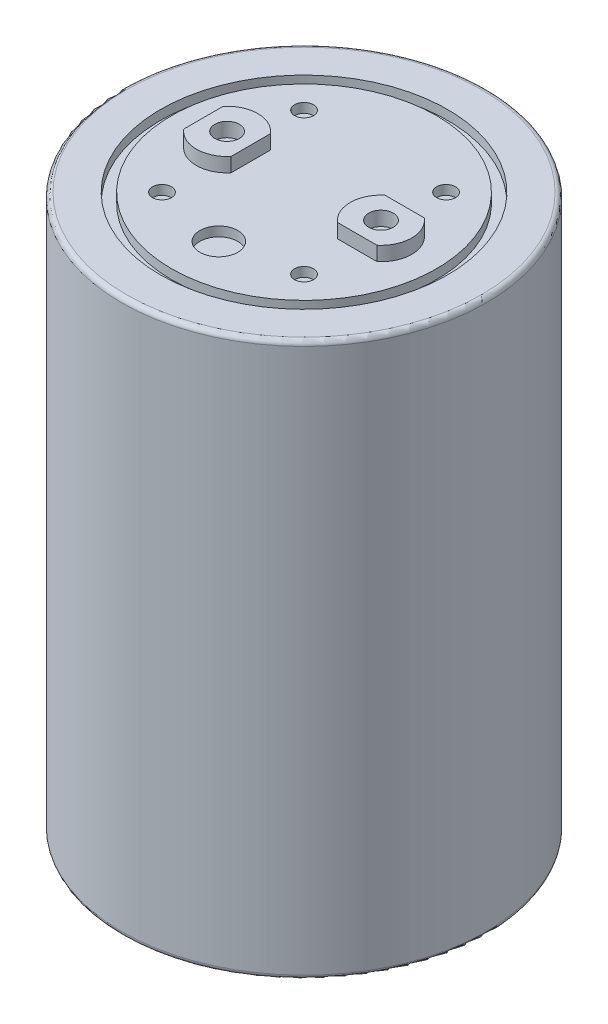
ISO-10303-21;
HEADER;
FILE_DESCRIPTION(('STEP AP214'),'2;1');
FILE_NAME('part.step','',(''),(''),'','','');
FILE_SCHEMA(('AUTOMOTIVE_DESIGN { 1 0 10303 214 1 1 1 1 }'));
ENDSEC;
DATA;
#1=APPLICATION_CONTEXT('core data for automotive mechanical design processes');
#2=APPLICATION_PROTOCOL_DEFINITION('international standard','automotive_design',2000,#1);
#3=PRODUCT_CONTEXT('',#1,'mechanical');
#4=PRODUCT('Part','Part','',(#3));
#5=PRODUCT_RELATED_PRODUCT_CATEGORY('part','',(#4));
#6=PRODUCT_DEFINITION_FORMATION('','',#4);
#7=PRODUCT_DEFINITION_CONTEXT('part definition',#1,'design');
#8=PRODUCT_DEFINITION('design','',#6,#7);
#9=PRODUCT_DEFINITION_SHAPE('','',#8);
#10=(LENGTH_UNIT() NAMED_UNIT(*) SI_UNIT(.MILLI.,.METRE.));
#11=(NAMED_UNIT(*) PLANE_ANGLE_UNIT() SI_UNIT($,.RADIAN.));
#12=(NAMED_UNIT(*) SI_UNIT($,.STERADIAN.) SOLID_ANGLE_UNIT());
#13=UNCERTAINTY_MEASURE_WITH_UNIT(LENGTH_MEASURE(1.E-05),#10,'distance_accuracy_value','');
#14=(GEOMETRIC_REPRESENTATION_CONTEXT(3) GLOBAL_UNCERTAINTY_ASSIGNED_CONTEXT((#13)) GLOBAL_UNIT_ASSIGNED_CONTEXT((#10,
#11,#12)) REPRESENTATION_CONTEXT('',''));
#15=CARTESIAN_POINT('',(0.,0.,0.));
#16=DIRECTION('',(0.,0.,1.));
#17=DIRECTION('',(1.,0.,0.));
#18=AXIS2_PLACEMENT_3D('',#15,#16,#17);
#19=CARTESIAN_POINT('',(1.1478244810946,60.4471649497469,37.8154701534106));
#20=DIRECTION('',(0.,1.,0.));
#21=DIRECTION('',(0.,0.,1.));
#22=AXIS2_PLACEMENT_3D('',#19,#20,#21);
#23=PLANE('',#22);
#24=CARTESIAN_POINT('',(-13.8521755189054,60.4471649497469,52.8154701534106));
#25=DIRECTION('',(0.,1.,0.));
#26=DIRECTION('',(0.,0.,-1.));
#27=AXIS2_PLACEMENT_3D('',#24,#25,#26);
#28=CIRCLE('',#27,2.);
#29=CARTESIAN_POINT('',(-13.8521755189054,60.4471649497469,50.8154701534106));
#30=VERTEX_POINT('',#29);
#31=EDGE_CURVE('E87',#30,#30,#28,.T.);
#32=ORIENTED_EDGE('',*,*,#31,.F.);
#33=EDGE_LOOP('',(#32));
#34=FACE_BOUND('',#33,.T.);
#35=CARTESIAN_POINT('',(16.1478244810946,60.4471649497469,52.8154701534106));
#36=DIRECTION('',(0.,1.,0.));
#37=DIRECTION('',(0.,0.,1.));
#38=AXIS2_PLACEMENT_3D('',#35,#36,#37);
#39=CIRCLE('',#38,2.);
#40=CARTESIAN_POINT('',(16.1478244810946,60.4471649497469,54.8154701534106));
#41=VERTEX_POINT('',#40);
#42=EDGE_CURVE('E80',#41,#41,#39,.T.);
#43=ORIENTED_EDGE('',*,*,#42,.F.);
#44=EDGE_LOOP('',(#43));
#45=FACE_BOUND('',#44,.T.);
#46=CARTESIAN_POINT('',(1.1478244810946,60.4471649497469,37.8154701534106));
#47=DIRECTION('',(0.,1.,0.));
#48=DIRECTION('',(0.,0.,1.));
#49=AXIS2_PLACEMENT_3D('',#46,#47,#48);
#50=CIRCLE('',#49,28.);
#51=CARTESIAN_POINT('',(1.1478244810946,60.4471649497469,65.8154701534106));
#52=VERTEX_POINT('',#51);
#53=EDGE_CURVE('E12',#52,#52,#50,.T.);
#54=ORIENTED_EDGE('',*,*,#53,.T.);
#55=EDGE_LOOP('',(#54));
#56=FACE_BOUND('',#55,.T.);
#57=CARTESIAN_POINT('',(-13.8521755189054,60.4471649497469,22.8154701534106));
#58=DIRECTION('',(0.,1.,0.));
#59=DIRECTION('',(0.,0.,-1.));
#60=AXIS2_PLACEMENT_3D('',#57,#58,#59);
#61=CIRCLE('',#60,2.);
#62=CARTESIAN_POINT('',(-13.8521755189054,60.4471649497469,20.8154701534106));
#63=VERTEX_POINT('',#62);
#64=EDGE_CURVE('E64',#63,#63,#61,.T.);
#65=ORIENTED_EDGE('',*,*,#64,.F.);
#66=EDGE_LOOP('',(#65));
#67=FACE_BOUND('',#66,.T.);
#68=CARTESIAN_POINT('',(16.1478244810946,60.4471649497469,22.8154701534106));
#69=DIRECTION('',(0.,1.,0.));
#70=DIRECTION('',(0.,0.,1.));
#71=AXIS2_PLACEMENT_3D('',#68,#69,#70);
#72=CIRCLE('',#71,2.);
#73=CARTESIAN_POINT('',(16.1478244810946,60.4471649497469,24.8154701534106));
#74=VERTEX_POINT('',#73);
#75=EDGE_CURVE('E81',#74,#74,#72,.T.);
#76=ORIENTED_EDGE('',*,*,#75,.F.);
#77=EDGE_LOOP('',(#76));
#78=FACE_BOUND('',#77,.T.);
#79=CARTESIAN_POINT('',(1.1478244810946,60.4471649497469,55.8154701534106));
#80=DIRECTION('',(0.,1.,0.));
#81=DIRECTION('',(0.,0.,1.));
#82=AXIS2_PLACEMENT_3D('',#79,#80,#81);
#83=CIRCLE('',#82,4.);
#84=CARTESIAN_POINT('',(1.1478244810946,60.4471649497469,59.8154701534106));
#85=VERTEX_POINT('',#84);
#86=EDGE_CURVE('E95',#85,#85,#83,.T.);
#87=ORIENTED_EDGE('',*,*,#86,.F.);
#88=EDGE_LOOP('',(#87));
#89=FACE_BOUND('',#88,.T.);
#90=ADVANCED_FACE('F50',(#34,#45,#56,#67,#78,#89),#23,.T.);
#91=CARTESIAN_POINT('',(1.1478244810946,58.4471649497469,37.8154701534106));
#92=DIRECTION('',(0.,1.,0.));
#93=DIRECTION('',(0.,0.,1.));
#94=AXIS2_PLACEMENT_3D('',#91,#92,#93);
#95=PLANE('',#94);
#96=CARTESIAN_POINT('',(1.1478244810946,58.4471649497469,37.8154701534106));
#97=DIRECTION('',(0.,1.,0.));
#98=DIRECTION('',(0.,0.,1.));
#99=AXIS2_PLACEMENT_3D('',#96,#97,#98);
#100=CIRCLE('',#99,28.);
#101=CARTESIAN_POINT('',(1.1478244810946,58.4471649497469,65.8154701534106));
#102=VERTEX_POINT('',#101);
#103=EDGE_CURVE('E54',#102,#102,#100,.T.);
#104=ORIENTED_EDGE('',*,*,#103,.F.);
#105=EDGE_LOOP('',(#104));
#106=FACE_BOUND('',#105,.T.);
#107=CARTESIAN_POINT('',(-13.8521755189054,58.4471649497469,22.8154701534106));
#108=DIRECTION('',(0.,1.,0.));
#109=DIRECTION('',(0.,0.,-1.));
#110=AXIS2_PLACEMENT_3D('',#107,#108,#109);
#111=CIRCLE('',#110,2.);
#112=CARTESIAN_POINT('',(-13.8521755189054,58.4471649497469,20.8154701534106));
#113=VERTEX_POINT('',#112);
#114=EDGE_CURVE('E67',#113,#113,#111,.T.);
#115=ORIENTED_EDGE('',*,*,#114,.T.);
#116=EDGE_LOOP('',(#115));
#117=FACE_BOUND('',#116,.T.);
#118=CARTESIAN_POINT('',(16.1478244810946,58.4471649497469,52.8154701534106));
#119=DIRECTION('',(0.,1.,0.));
#120=DIRECTION('',(0.,0.,1.));
#121=AXIS2_PLACEMENT_3D('',#118,#119,#120);
#122=CIRCLE('',#121,2.);
#123=CARTESIAN_POINT('',(16.1478244810946,58.4471649497469,54.8154701534106));
#124=VERTEX_POINT('',#123);
#125=EDGE_CURVE('E78',#124,#124,#122,.T.);
#126=ORIENTED_EDGE('',*,*,#125,.T.);
#127=EDGE_LOOP('',(#126));
#128=FACE_BOUND('',#127,.T.);
#129=CARTESIAN_POINT('',(16.1478244810946,58.4471649497469,22.8154701534106));
#130=DIRECTION('',(0.,1.,0.));
#131=DIRECTION('',(0.,0.,1.));
#132=AXIS2_PLACEMENT_3D('',#129,#130,#131);
#133=CIRCLE('',#132,2.);
#134=CARTESIAN_POINT('',(16.1478244810946,58.4471649497469,24.8154701534106));
#135=VERTEX_POINT('',#134);
#136=EDGE_CURVE('E85',#135,#135,#133,.T.);
#137=ORIENTED_EDGE('',*,*,#136,.T.);
#138=EDGE_LOOP('',(#137));
#139=FACE_BOUND('',#138,.T.);
#140=CARTESIAN_POINT('',(-13.8521755189054,58.4471649497469,52.8154701534106));
#141=DIRECTION('',(0.,1.,0.));
#142=DIRECTION('',(0.,0.,-1.));
#143=AXIS2_PLACEMENT_3D('',#140,#141,#142);
#144=CIRCLE('',#143,2.);
#145=CARTESIAN_POINT('',(-13.8521755189054,58.4471649497469,50.8154701534106));
#146=VERTEX_POINT('',#145);
#147=EDGE_CURVE('E92',#146,#146,#144,.T.);
#148=ORIENTED_EDGE('',*,*,#147,.T.);
#149=EDGE_LOOP('',(#148));
#150=FACE_BOUND('',#149,.T.);
#151=CARTESIAN_POINT('',(1.1478244810946,58.4471649497469,55.8154701534106));
#152=DIRECTION('',(0.,1.,0.));
#153=DIRECTION('',(0.,0.,1.));
#154=AXIS2_PLACEMENT_3D('',#151,#152,#153);
#155=CIRCLE('',#154,4.);
#156=CARTESIAN_POINT('',(1.1478244810946,58.4471649497469,59.8154701534106));
#157=VERTEX_POINT('',#156);
#158=EDGE_CURVE('E100',#157,#157,#155,.T.);
#159=ORIENTED_EDGE('',*,*,#158,.T.);
#160=EDGE_LOOP('',(#159));
#161=FACE_BOUND('',#160,.T.);
#162=ADVANCED_FACE('F111',(#106,#117,#128,#139,#150,#161),#95,.F.);
#163=CARTESIAN_POINT('',(1.1478244810946,60.4471649497469,37.8154701534106));
#164=DIRECTION('',(0.,-1.,0.));
#165=DIRECTION('',(0.,0.,-1.));
#166=AXIS2_PLACEMENT_3D('',#163,#164,#165);
#167=CYLINDRICAL_SURFACE('',#166,28.);
#168=ORIENTED_EDGE('',*,*,#53,.F.);
#169=EDGE_LOOP('',(#168));
#170=FACE_BOUND('',#169,.T.);
#171=ORIENTED_EDGE('',*,*,#103,.T.);
#172=EDGE_LOOP('',(#171));
#173=FACE_BOUND('',#172,.T.);
#174=ADVANCED_FACE('F52',(#170,#173),#167,.T.);
#175=CARTESIAN_POINT('',(-13.8521755189054,60.4471649497469,22.8154701534106));
#176=DIRECTION('',(0.,-1.,0.));
#177=DIRECTION('',(0.,0.,-1.));
#178=AXIS2_PLACEMENT_3D('',#175,#176,#177);
#179=CYLINDRICAL_SURFACE('',#178,2.);
#180=ORIENTED_EDGE('',*,*,#64,.T.);
#181=EDGE_LOOP('',(#180));
#182=FACE_BOUND('',#181,.T.);
#183=ORIENTED_EDGE('',*,*,#114,.F.);
#184=EDGE_LOOP('',(#183));
#185=FACE_BOUND('',#184,.T.);
#186=ADVANCED_FACE('F121',(#182,#185),#179,.F.);
#187=CARTESIAN_POINT('',(16.1478244810946,60.4471649497469,52.8154701534106));
#188=DIRECTION('',(0.,-1.,0.));
#189=DIRECTION('',(0.,0.,-1.));
#190=AXIS2_PLACEMENT_3D('',#187,#188,#189);
#191=CYLINDRICAL_SURFACE('',#190,2.);
#192=ORIENTED_EDGE('',*,*,#42,.T.);
#193=EDGE_LOOP('',(#192));
#194=FACE_BOUND('',#193,.T.);
#195=ORIENTED_EDGE('',*,*,#125,.F.);
#196=EDGE_LOOP('',(#195));
#197=FACE_BOUND('',#196,.T.);
#198=ADVANCED_FACE('F124',(#194,#197),#191,.F.);
#199=CARTESIAN_POINT('',(16.1478244810946,60.4471649497469,22.8154701534106));
#200=DIRECTION('',(0.,-1.,0.));
#201=DIRECTION('',(0.,0.,-1.));
#202=AXIS2_PLACEMENT_3D('',#199,#200,#201);
#203=CYLINDRICAL_SURFACE('',#202,2.);
#204=ORIENTED_EDGE('',*,*,#75,.T.);
#205=EDGE_LOOP('',(#204));
#206=FACE_BOUND('',#205,.T.);
#207=ORIENTED_EDGE('',*,*,#136,.F.);
#208=EDGE_LOOP('',(#207));
#209=FACE_BOUND('',#208,.T.);
#210=ADVANCED_FACE('F128',(#206,#209),#203,.F.);
#211=CARTESIAN_POINT('',(-13.8521755189054,60.4471649497469,52.8154701534106));
#212=DIRECTION('',(0.,-1.,0.));
#213=DIRECTION('',(0.,0.,-1.));
#214=AXIS2_PLACEMENT_3D('',#211,#212,#213);
#215=CYLINDRICAL_SURFACE('',#214,2.);
#216=ORIENTED_EDGE('',*,*,#31,.T.);
#217=EDGE_LOOP('',(#216));
#218=FACE_BOUND('',#217,.T.);
#219=ORIENTED_EDGE('',*,*,#147,.F.);
#220=EDGE_LOOP('',(#219));
#221=FACE_BOUND('',#220,.T.);
#222=ADVANCED_FACE('F132',(#218,#221),#215,.F.);
#223=CARTESIAN_POINT('',(1.1478244810946,60.4471649497469,55.8154701534106));
#224=DIRECTION('',(0.,-1.,0.));
#225=DIRECTION('',(0.,0.,-1.));
#226=AXIS2_PLACEMENT_3D('',#223,#224,#225);
#227=CYLINDRICAL_SURFACE('',#226,4.);
#228=ORIENTED_EDGE('',*,*,#86,.T.);
#229=EDGE_LOOP('',(#228));
#230=FACE_BOUND('',#229,.T.);
#231=ORIENTED_EDGE('',*,*,#158,.F.);
#232=EDGE_LOOP('',(#231));
#233=FACE_BOUND('',#232,.T.);
#234=ADVANCED_FACE('F107',(#230,#233),#227,.F.);
#235=CLOSED_SHELL('',(#90,#162,#174,#186,#198,#210,#222,#234));
#236=MANIFOLD_SOLID_BREP('B2',#235);
#237=CARTESIAN_POINT('',(1.1478244810946,58.4471649497469,37.8154701534106));
#238=DIRECTION('',(0.,1.,0.));
#239=DIRECTION('',(0.,0.,1.));
#240=AXIS2_PLACEMENT_3D('',#237,#238,#239);
#241=PLANE('',#240);
#242=DIRECTION('',(0.,0.,1.));
#243=VECTOR('',#242,1.);
#244=CARTESIAN_POINT('',(-20.1021755189054,58.4471649497469,33.6621582219516));
#245=LINE('',#244,#243);
#246=CARTESIAN_POINT('',(-20.1021755189054,58.4471649497469,33.6621582219516));
#247=VERTEX_POINT('',#246);
#248=CARTESIAN_POINT('',(-20.1021755189054,58.4471649497469,41.9687820848696));
#249=VERTEX_POINT('',#248);
#250=EDGE_CURVE('E324',#247,#249,#245,.T.);
#251=ORIENTED_EDGE('',*,*,#250,.F.);
#252=CARTESIAN_POINT('',(-15.1021755189054,58.4471649497469,37.8154701534106));
#253=DIRECTION('',(0.,1.,0.));
#254=DIRECTION('',(0.,0.,1.));
#255=AXIS2_PLACEMENT_3D('',#252,#253,#254);
#256=CIRCLE('',#255,6.5);
#257=CARTESIAN_POINT('',(-10.1021755189054,58.4471649497469,33.6621582219516));
#258=VERTEX_POINT('',#257);
#259=EDGE_CURVE('E306',#258,#247,#256,.T.);
#260=ORIENTED_EDGE('',*,*,#259,.F.);
#261=DIRECTION('',(0.,0.,-1.));
#262=VECTOR('',#261,1.);
#263=CARTESIAN_POINT('',(-10.1021755189054,58.4471649497469,41.9687820848696));
#264=LINE('',#263,#262);
#265=CARTESIAN_POINT('',(-10.1021755189054,58.4471649497469,41.9687820848696));
#266=VERTEX_POINT('',#265);
#267=EDGE_CURVE('E315',#266,#258,#264,.T.);
#268=ORIENTED_EDGE('',*,*,#267,.F.);
#269=CARTESIAN_POINT('',(-15.1021755189054,58.4471649497469,37.8154701534106));
#270=DIRECTION('',(0.,1.,0.));
#271=DIRECTION('',(0.,0.,-1.));
#272=AXIS2_PLACEMENT_3D('',#269,#270,#271);
#273=CIRCLE('',#272,6.5);
#274=EDGE_CURVE('E326',#249,#266,#273,.T.);
#275=ORIENTED_EDGE('',*,*,#274,.F.);
#276=EDGE_LOOP('',(#251,#260,#268,#275));
#277=FACE_BOUND('',#276,.T.);
#278=DIRECTION('',(-1.,0.,0.));
#279=VECTOR('',#278,1.);
#280=CARTESIAN_POINT('',(13.2445125496356,58.4471649497469,32.8154701534106));
#281=LINE('',#280,#279);
#282=CARTESIAN_POINT('',(21.5511364125536,58.4471649497469,32.8154701534106));
#283=VERTEX_POINT('',#282);
#284=CARTESIAN_POINT('',(13.2445125496356,58.4471649497469,32.8154701534106));
#285=VERTEX_POINT('',#284);
#286=EDGE_CURVE('E591',#283,#285,#281,.T.);
#287=ORIENTED_EDGE('',*,*,#286,.F.);
#288=CARTESIAN_POINT('',(17.3978244810946,58.4471649497469,37.8154701534106));
#289=DIRECTION('',(0.,1.,0.));
#290=DIRECTION('',(0.,0.,-1.));
#291=AXIS2_PLACEMENT_3D('',#288,#289,#290);
#292=CIRCLE('',#291,6.5);
#293=CARTESIAN_POINT('',(21.5511364125536,58.4471649497469,42.8154701534106));
#294=VERTEX_POINT('',#293);
#295=EDGE_CURVE('E301',#294,#283,#292,.T.);
#296=ORIENTED_EDGE('',*,*,#295,.F.);
#297=DIRECTION('',(1.,0.,0.));
#298=VECTOR('',#297,1.);
#299=CARTESIAN_POINT('',(21.5511364125536,58.4471649497469,42.8154701534106));
#300=LINE('',#299,#298);
#301=CARTESIAN_POINT('',(13.2445125496356,58.4471649497469,42.8154701534106));
#302=VERTEX_POINT('',#301);
#303=EDGE_CURVE('E297',#302,#294,#300,.T.);
#304=ORIENTED_EDGE('',*,*,#303,.F.);
#305=CARTESIAN_POINT('',(17.3978244810946,58.4471649497469,37.8154701534106));
#306=DIRECTION('',(0.,1.,0.));
#307=DIRECTION('',(0.,0.,1.));
#308=AXIS2_PLACEMENT_3D('',#305,#306,#307);
#309=CIRCLE('',#308,6.50000000000001);
#310=EDGE_CURVE('E593',#285,#302,#309,.T.);
#311=ORIENTED_EDGE('',*,*,#310,.F.);
#312=EDGE_LOOP('',(#287,#296,#304,#311));
#313=FACE_BOUND('',#312,.T.);
#314=CARTESIAN_POINT('',(1.1478244810946,58.4471649497469,37.8154701534106));
#315=DIRECTION('',(0.,1.,0.));
#316=DIRECTION('',(0.,0.,1.));
#317=AXIS2_PLACEMENT_3D('',#314,#315,#316);
#318=CIRCLE('',#317,30.3);
#319=CARTESIAN_POINT('',(1.1478244810946,58.4471649497469,68.1154701534106));
#320=VERTEX_POINT('',#319);
#321=EDGE_CURVE('E343',#320,#320,#318,.F.);
#322=ORIENTED_EDGE('',*,*,#321,.F.);
#323=EDGE_LOOP('',(#322));
#324=FACE_BOUND('',#323,.T.);
#325=ADVANCED_FACE('F211',(#277,#313,#324),#241,.T.);
#326=CARTESIAN_POINT('',(-15.1021755189054,63.4471649497469,37.8154701534106));
#327=DIRECTION('',(0.,1.,0.));
#328=DIRECTION('',(0.,0.,1.));
#329=AXIS2_PLACEMENT_3D('',#326,#327,#328);
#330=PLANE('',#329);
#331=CARTESIAN_POINT('',(-15.1021755189054,63.4471649497469,37.8154701534106));
#332=DIRECTION('',(0.,1.,0.));
#333=DIRECTION('',(0.,0.,1.));
#334=AXIS2_PLACEMENT_3D('',#331,#332,#333);
#335=CIRCLE('',#334,6.5);
#336=CARTESIAN_POINT('',(-10.1021755189054,63.4471649497469,33.6621582219516));
#337=VERTEX_POINT('',#336);
#338=CARTESIAN_POINT('',(-20.1021755189054,63.4471649497469,33.6621582219516));
#339=VERTEX_POINT('',#338);
#340=EDGE_CURVE('E311',#337,#339,#335,.T.);
#341=ORIENTED_EDGE('',*,*,#340,.T.);
#342=DIRECTION('',(0.,0.,1.));
#343=VECTOR('',#342,1.);
#344=CARTESIAN_POINT('',(-20.1021755189054,63.4471649497469,33.6621582219516));
#345=LINE('',#344,#343);
#346=CARTESIAN_POINT('',(-20.1021755189054,63.4471649497469,41.9687820848696));
#347=VERTEX_POINT('',#346);
#348=EDGE_CURVE('E314',#339,#347,#345,.T.);
#349=ORIENTED_EDGE('',*,*,#348,.T.);
#350=CARTESIAN_POINT('',(-15.1021755189054,63.4471649497469,37.8154701534106));
#351=DIRECTION('',(0.,1.,0.));
#352=DIRECTION('',(0.,0.,-1.));
#353=AXIS2_PLACEMENT_3D('',#350,#351,#352);
#354=CIRCLE('',#353,6.5);
#355=CARTESIAN_POINT('',(-10.1021755189054,63.4471649497469,41.9687820848696));
#356=VERTEX_POINT('',#355);
#357=EDGE_CURVE('E317',#347,#356,#354,.T.);
#358=ORIENTED_EDGE('',*,*,#357,.T.);
#359=DIRECTION('',(0.,0.,-1.));
#360=VECTOR('',#359,1.);
#361=CARTESIAN_POINT('',(-10.1021755189054,63.4471649497469,41.9687820848696));
#362=LINE('',#361,#360);
#363=EDGE_CURVE('E319',#356,#337,#362,.T.);
#364=ORIENTED_EDGE('',*,*,#363,.T.);
#365=EDGE_LOOP('',(#341,#349,#358,#364));
#366=FACE_BOUND('',#365,.T.);
#367=CARTESIAN_POINT('',(-15.1021755189054,63.4471649497469,37.8154701534106));
#368=DIRECTION('',(0.,1.,0.));
#369=DIRECTION('',(0.,0.,1.));
#370=AXIS2_PLACEMENT_3D('',#367,#368,#369);
#371=CIRCLE('',#370,2.6);
#372=CARTESIAN_POINT('',(-15.1021755189054,63.4471649497469,40.4154701534106));
#373=VERTEX_POINT('',#372);
#374=EDGE_CURVE('E303',#373,#373,#371,.T.);
#375=ORIENTED_EDGE('',*,*,#374,.F.);
#376=EDGE_LOOP('',(#375));
#377=FACE_BOUND('',#376,.T.);
#378=ADVANCED_FACE('F375',(#366,#377),#330,.T.);
#379=CARTESIAN_POINT('',(-15.1021755189054,63.4471649497469,37.8154701534106));
#380=DIRECTION('',(0.,-1.,0.));
#381=DIRECTION('',(0.,0.,-1.));
#382=AXIS2_PLACEMENT_3D('',#379,#380,#381);
#383=CYLINDRICAL_SURFACE('',#382,6.5);
#384=ORIENTED_EDGE('',*,*,#259,.T.);
#385=DIRECTION('',(0.,-1.,0.));
#386=VECTOR('',#385,1.);
#387=CARTESIAN_POINT('',(-20.1021755189054,63.4471649497469,33.6621582219516));
#388=LINE('',#387,#386);
#389=EDGE_CURVE('E335',#339,#247,#388,.T.);
#390=ORIENTED_EDGE('',*,*,#389,.F.);
#391=ORIENTED_EDGE('',*,*,#340,.F.);
#392=DIRECTION('',(0.,-1.,0.));
#393=VECTOR('',#392,1.);
#394=CARTESIAN_POINT('',(-10.1021755189054,63.4471649497469,33.6621582219516));
#395=LINE('',#394,#393);
#396=EDGE_CURVE('E321',#337,#258,#395,.T.);
#397=ORIENTED_EDGE('',*,*,#396,.T.);
#398=EDGE_LOOP('',(#384,#390,#391,#397));
#399=FACE_BOUND('',#398,.T.);
#400=ADVANCED_FACE('F383',(#399),#383,.T.);
#401=CARTESIAN_POINT('',(-20.1021755189054,63.4471649497469,33.6621582219516));
#402=DIRECTION('',(1.,0.,0.));
#403=DIRECTION('',(0.,0.,-1.));
#404=AXIS2_PLACEMENT_3D('',#401,#402,#403);
#405=PLANE('',#404);
#406=ORIENTED_EDGE('',*,*,#250,.T.);
#407=DIRECTION('',(0.,-1.,0.));
#408=VECTOR('',#407,1.);
#409=CARTESIAN_POINT('',(-20.1021755189054,63.4471649497469,41.9687820848696));
#410=LINE('',#409,#408);
#411=EDGE_CURVE('E332',#347,#249,#410,.T.);
#412=ORIENTED_EDGE('',*,*,#411,.F.);
#413=ORIENTED_EDGE('',*,*,#348,.F.);
#414=ORIENTED_EDGE('',*,*,#389,.T.);
#415=EDGE_LOOP('',(#406,#412,#413,#414));
#416=FACE_BOUND('',#415,.T.);
#417=ADVANCED_FACE('F416',(#416),#405,.F.);
#418=CARTESIAN_POINT('',(-15.1021755189054,63.4471649497469,37.8154701534106));
#419=DIRECTION('',(0.,-1.,0.));
#420=DIRECTION('',(0.,0.,-1.));
#421=AXIS2_PLACEMENT_3D('',#418,#419,#420);
#422=CYLINDRICAL_SURFACE('',#421,6.5);
#423=ORIENTED_EDGE('',*,*,#274,.T.);
#424=DIRECTION('',(0.,-1.,0.));
#425=VECTOR('',#424,1.);
#426=CARTESIAN_POINT('',(-10.1021755189054,63.4471649497469,41.9687820848696));
#427=LINE('',#426,#425);
#428=EDGE_CURVE('E234',#356,#266,#427,.T.);
#429=ORIENTED_EDGE('',*,*,#428,.F.);
#430=ORIENTED_EDGE('',*,*,#357,.F.);
#431=ORIENTED_EDGE('',*,*,#411,.T.);
#432=EDGE_LOOP('',(#423,#429,#430,#431));
#433=FACE_BOUND('',#432,.T.);
#434=ADVANCED_FACE('F409',(#433),#422,.T.);
#435=CARTESIAN_POINT('',(-10.1021755189054,63.4471649497469,41.9687820848696));
#436=DIRECTION('',(-1.,0.,0.));
#437=DIRECTION('',(0.,0.,1.));
#438=AXIS2_PLACEMENT_3D('',#435,#436,#437);
#439=PLANE('',#438);
#440=ORIENTED_EDGE('',*,*,#267,.T.);
#441=ORIENTED_EDGE('',*,*,#396,.F.);
#442=ORIENTED_EDGE('',*,*,#363,.F.);
#443=ORIENTED_EDGE('',*,*,#428,.T.);
#444=EDGE_LOOP('',(#440,#441,#442,#443));
#445=FACE_BOUND('',#444,.T.);
#446=ADVANCED_FACE('F401',(#445),#439,.F.);
#447=CARTESIAN_POINT('',(-15.1021755189054,63.4471649497469,37.8154701534106));
#448=DIRECTION('',(0.,-1.,0.));
#449=DIRECTION('',(0.,0.,-1.));
#450=AXIS2_PLACEMENT_3D('',#447,#448,#449);
#451=CYLINDRICAL_SURFACE('',#450,2.6);
#452=ORIENTED_EDGE('',*,*,#374,.T.);
#453=EDGE_LOOP('',(#452));
#454=FACE_BOUND('',#453,.T.);
#455=CARTESIAN_POINT('',(-15.1021755189054,58.4471649497469,37.8154701534106));
#456=DIRECTION('',(0.,1.,0.));
#457=DIRECTION('',(0.,0.,1.));
#458=AXIS2_PLACEMENT_3D('',#455,#456,#457);
#459=CIRCLE('',#458,2.6);
#460=CARTESIAN_POINT('',(-15.1021755189054,58.4471649497469,40.4154701534106));
#461=VERTEX_POINT('',#460);
#462=EDGE_CURVE('E337',#461,#461,#459,.F.);
#463=ORIENTED_EDGE('',*,*,#462,.T.);
#464=EDGE_LOOP('',(#463));
#465=FACE_BOUND('',#464,.T.);
#466=ADVANCED_FACE('F394',(#454,#465),#451,.F.);
#467=ORIENTED_EDGE('',*,*,#462,.F.);
#468=EDGE_LOOP('',(#467));
#469=FACE_BOUND('',#468,.T.);
#470=ADVANCED_FACE('F379',(#469),#241,.T.);
#471=CARTESIAN_POINT('',(17.3978244810946,63.4471649497469,37.8154701534106));
#472=DIRECTION('',(0.,-1.,0.));
#473=DIRECTION('',(0.,0.,-1.));
#474=AXIS2_PLACEMENT_3D('',#471,#472,#473);
#475=PLANE('',#474);
#476=CARTESIAN_POINT('',(17.3978244810946,63.4471649497469,37.8154701534106));
#477=DIRECTION('',(0.,1.,0.));
#478=DIRECTION('',(0.,0.,-1.));
#479=AXIS2_PLACEMENT_3D('',#476,#477,#478);
#480=CIRCLE('',#479,6.5);
#481=CARTESIAN_POINT('',(21.5511364125536,63.4471649497469,42.8154701534106));
#482=VERTEX_POINT('',#481);
#483=CARTESIAN_POINT('',(21.5511364125536,63.4471649497469,32.8154701534106));
#484=VERTEX_POINT('',#483);
#485=EDGE_CURVE('E288',#482,#484,#480,.T.);
#486=ORIENTED_EDGE('',*,*,#485,.T.);
#487=DIRECTION('',(-1.,0.,0.));
#488=VECTOR('',#487,1.);
#489=CARTESIAN_POINT('',(13.2445125496356,63.4471649497469,32.8154701534106));
#490=LINE('',#489,#488);
#491=CARTESIAN_POINT('',(13.2445125496356,63.4471649497469,32.8154701534106));
#492=VERTEX_POINT('',#491);
#493=EDGE_CURVE('E277',#484,#492,#490,.T.);
#494=ORIENTED_EDGE('',*,*,#493,.T.);
#495=CARTESIAN_POINT('',(17.3978244810946,63.4471649497469,37.8154701534106));
#496=DIRECTION('',(0.,1.,0.));
#497=DIRECTION('',(0.,0.,1.));
#498=AXIS2_PLACEMENT_3D('',#495,#496,#497);
#499=CIRCLE('',#498,6.50000000000001);
#500=CARTESIAN_POINT('',(13.2445125496356,63.4471649497469,42.8154701534106));
#501=VERTEX_POINT('',#500);
#502=EDGE_CURVE('E287',#492,#501,#499,.T.);
#503=ORIENTED_EDGE('',*,*,#502,.T.);
#504=DIRECTION('',(1.,0.,0.));
#505=VECTOR('',#504,1.);
#506=CARTESIAN_POINT('',(21.5511364125536,63.4471649497469,42.8154701534106));
#507=LINE('',#506,#505);
#508=EDGE_CURVE('E293',#501,#482,#507,.T.);
#509=ORIENTED_EDGE('',*,*,#508,.T.);
#510=EDGE_LOOP('',(#486,#494,#503,#509));
#511=FACE_BOUND('',#510,.T.);
#512=CARTESIAN_POINT('',(17.3978244810946,63.4471649497469,37.8154701534106));
#513=DIRECTION('',(0.,1.,0.));
#514=DIRECTION('',(0.,0.,1.));
#515=AXIS2_PLACEMENT_3D('',#512,#513,#514);
#516=CIRCLE('',#515,2.6);
#517=CARTESIAN_POINT('',(17.3978244810946,63.4471649497469,40.4154701534106));
#518=VERTEX_POINT('',#517);
#519=EDGE_CURVE('E582',#518,#518,#516,.T.);
#520=ORIENTED_EDGE('',*,*,#519,.F.);
#521=EDGE_LOOP('',(#520));
#522=FACE_BOUND('',#521,.T.);
#523=ADVANCED_FACE('F291',(#511,#522),#475,.F.);
#524=CARTESIAN_POINT('',(17.3978244810946,63.4471649497469,37.8154701534106));
#525=DIRECTION('',(0.,-1.,0.));
#526=DIRECTION('',(0.,0.,-1.));
#527=AXIS2_PLACEMENT_3D('',#524,#525,#526);
#528=CYLINDRICAL_SURFACE('',#527,6.5);
#529=ORIENTED_EDGE('',*,*,#295,.T.);
#530=DIRECTION('',(0.,-1.,0.));
#531=VECTOR('',#530,1.);
#532=CARTESIAN_POINT('',(21.5511364125536,63.4471649497469,32.8154701534106));
#533=LINE('',#532,#531);
#534=EDGE_CURVE('E281',#484,#283,#533,.T.);
#535=ORIENTED_EDGE('',*,*,#534,.F.);
#536=ORIENTED_EDGE('',*,*,#485,.F.);
#537=DIRECTION('',(0.,-1.,0.));
#538=VECTOR('',#537,1.);
#539=CARTESIAN_POINT('',(21.5511364125536,63.4471649497469,42.8154701534106));
#540=LINE('',#539,#538);
#541=EDGE_CURVE('E589',#482,#294,#540,.T.);
#542=ORIENTED_EDGE('',*,*,#541,.T.);
#543=EDGE_LOOP('',(#529,#535,#536,#542));
#544=FACE_BOUND('',#543,.T.);
#545=ADVANCED_FACE('F299',(#544),#528,.T.);
#546=CARTESIAN_POINT('',(13.2445125496356,63.4471649497469,32.8154701534106));
#547=DIRECTION('',(0.,0.,1.));
#548=DIRECTION('',(1.,0.,0.));
#549=AXIS2_PLACEMENT_3D('',#546,#547,#548);
#550=PLANE('',#549);
#551=ORIENTED_EDGE('',*,*,#286,.T.);
#552=DIRECTION('',(0.,-1.,0.));
#553=VECTOR('',#552,1.);
#554=CARTESIAN_POINT('',(13.2445125496356,63.4471649497469,32.8154701534106));
#555=LINE('',#554,#553);
#556=EDGE_CURVE('E284',#492,#285,#555,.T.);
#557=ORIENTED_EDGE('',*,*,#556,.F.);
#558=ORIENTED_EDGE('',*,*,#493,.F.);
#559=ORIENTED_EDGE('',*,*,#534,.T.);
#560=EDGE_LOOP('',(#551,#557,#558,#559));
#561=FACE_BOUND('',#560,.T.);
#562=ADVANCED_FACE('F279',(#561),#550,.F.);
#563=CARTESIAN_POINT('',(17.3978244810946,63.4471649497469,37.8154701534106));
#564=DIRECTION('',(0.,-1.,0.));
#565=DIRECTION('',(0.,0.,-1.));
#566=AXIS2_PLACEMENT_3D('',#563,#564,#565);
#567=CYLINDRICAL_SURFACE('',#566,6.50000000000001);
#568=ORIENTED_EDGE('',*,*,#310,.T.);
#569=DIRECTION('',(0.,-1.,0.));
#570=VECTOR('',#569,1.);
#571=CARTESIAN_POINT('',(13.2445125496356,63.4471649497469,42.8154701534106));
#572=LINE('',#571,#570);
#573=EDGE_CURVE('E226',#501,#302,#572,.T.);
#574=ORIENTED_EDGE('',*,*,#573,.F.);
#575=ORIENTED_EDGE('',*,*,#502,.F.);
#576=ORIENTED_EDGE('',*,*,#556,.T.);
#577=EDGE_LOOP('',(#568,#574,#575,#576));
#578=FACE_BOUND('',#577,.T.);
#579=ADVANCED_FACE('F478',(#578),#567,.T.);
#580=CARTESIAN_POINT('',(21.5511364125536,63.4471649497469,42.8154701534106));
#581=DIRECTION('',(0.,0.,-1.));
#582=DIRECTION('',(-1.,0.,0.));
#583=AXIS2_PLACEMENT_3D('',#580,#581,#582);
#584=PLANE('',#583);
#585=ORIENTED_EDGE('',*,*,#303,.T.);
#586=ORIENTED_EDGE('',*,*,#541,.F.);
#587=ORIENTED_EDGE('',*,*,#508,.F.);
#588=ORIENTED_EDGE('',*,*,#573,.T.);
#589=EDGE_LOOP('',(#585,#586,#587,#588));
#590=FACE_BOUND('',#589,.T.);
#591=ADVANCED_FACE('F486',(#590),#584,.F.);
#592=CARTESIAN_POINT('',(17.3978244810946,63.4471649497469,37.8154701534106));
#593=DIRECTION('',(0.,-1.,0.));
#594=DIRECTION('',(0.,0.,-1.));
#595=AXIS2_PLACEMENT_3D('',#592,#593,#594);
#596=CYLINDRICAL_SURFACE('',#595,2.6);
#597=ORIENTED_EDGE('',*,*,#519,.T.);
#598=EDGE_LOOP('',(#597));
#599=FACE_BOUND('',#598,.T.);
#600=CARTESIAN_POINT('',(17.3978244810946,58.4471649497469,37.8154701534106));
#601=DIRECTION('',(0.,1.,0.));
#602=DIRECTION('',(0.,0.,1.));
#603=AXIS2_PLACEMENT_3D('',#600,#601,#602);
#604=CIRCLE('',#603,2.6);
#605=CARTESIAN_POINT('',(17.3978244810946,58.4471649497469,40.4154701534106));
#606=VERTEX_POINT('',#605);
#607=EDGE_CURVE('E340',#606,#606,#604,.F.);
#608=ORIENTED_EDGE('',*,*,#607,.T.);
#609=EDGE_LOOP('',(#608));
#610=FACE_BOUND('',#609,.T.);
#611=ADVANCED_FACE('F391',(#599,#610),#596,.F.);
#612=ORIENTED_EDGE('',*,*,#607,.F.);
#613=EDGE_LOOP('',(#612));
#614=FACE_BOUND('',#613,.T.);
#615=ADVANCED_FACE('F378',(#614),#241,.T.);
#616=CARTESIAN_POINT('',(1.1478244810946,60.4471649497469,37.8154701534106));
#617=DIRECTION('',(0.,1.,0.));
#618=DIRECTION('',(0.,0.,1.));
#619=AXIS2_PLACEMENT_3D('',#616,#617,#618);
#620=PLANE('',#619);
#621=CARTESIAN_POINT('',(1.1478244810946,60.4471649497469,37.8154701534106));
#622=DIRECTION('',(0.,1.,0.));
#623=DIRECTION('',(0.,0.,1.));
#624=AXIS2_PLACEMENT_3D('',#621,#622,#623);
#625=CIRCLE('',#624,37.5);
#626=CARTESIAN_POINT('',(1.1478244810946,60.4471649497469,75.3154701534106));
#627=VERTEX_POINT('',#626);
#628=EDGE_CURVE('E219',#627,#627,#625,.T.);
#629=ORIENTED_EDGE('',*,*,#628,.T.);
#630=EDGE_LOOP('',(#629));
#631=FACE_BOUND('',#630,.T.);
#632=CARTESIAN_POINT('',(1.1478244810946,60.4471649497469,37.8154701534106));
#633=DIRECTION('',(0.,1.,0.));
#634=DIRECTION('',(0.,0.,1.));
#635=AXIS2_PLACEMENT_3D('',#632,#633,#634);
#636=CIRCLE('',#635,30.3);
#637=CARTESIAN_POINT('',(1.1478244810946,60.4471649497469,68.1154701534106));
#638=VERTEX_POINT('',#637);
#639=EDGE_CURVE('E579',#638,#638,#636,.T.);
#640=ORIENTED_EDGE('',*,*,#639,.F.);
#641=EDGE_LOOP('',(#640));
#642=FACE_BOUND('',#641,.T.);
#643=ADVANCED_FACE('F357',(#631,#642),#620,.T.);
#644=CARTESIAN_POINT('',(1.1478244810946,60.4471649497469,37.8154701534106));
#645=DIRECTION('',(0.,-1.,0.));
#646=DIRECTION('',(0.,0.,-1.));
#647=AXIS2_PLACEMENT_3D('',#644,#645,#646);
#648=CYLINDRICAL_SURFACE('',#647,30.3);
#649=ORIENTED_EDGE('',*,*,#639,.T.);
#650=EDGE_LOOP('',(#649));
#651=FACE_BOUND('',#650,.T.);
#652=ORIENTED_EDGE('',*,*,#321,.T.);
#653=EDGE_LOOP('',(#652));
#654=FACE_BOUND('',#653,.T.);
#655=ADVANCED_FACE('F519',(#651,#654),#648,.F.);
#656=CARTESIAN_POINT('',(1.1478244810946,-56.5528350502531,37.8154701534106));
#657=DIRECTION('',(0.,1.,0.));
#658=DIRECTION('',(0.,0.,1.));
#659=AXIS2_PLACEMENT_3D('',#656,#657,#658);
#660=PLANE('',#659);
#661=CARTESIAN_POINT('',(1.1478244810946,-56.5528350502531,37.8154701534106));
#662=DIRECTION('',(0.,1.,0.));
#663=DIRECTION('',(0.,0.,1.));
#664=AXIS2_PLACEMENT_3D('',#661,#662,#663);
#665=CIRCLE('',#664,6.);
#666=CARTESIAN_POINT('',(1.1478244810946,-56.5528350502531,43.8154701534106));
#667=VERTEX_POINT('',#666);
#668=EDGE_CURVE('E48',#667,#667,#665,.F.);
#669=ORIENTED_EDGE('',*,*,#668,.F.);
#670=EDGE_LOOP('',(#669));
#671=FACE_BOUND('',#670,.T.);
#672=CARTESIAN_POINT('',(1.1478244810946,-56.5528350502531,37.8154701534106));
#673=DIRECTION('',(0.,1.,0.));
#674=DIRECTION('',(0.,0.,1.));
#675=AXIS2_PLACEMENT_3D('',#672,#673,#674);
#676=CIRCLE('',#675,37.5);
#677=CARTESIAN_POINT('',(1.1478244810946,-56.5528350502531,75.3154701534106));
#678=VERTEX_POINT('',#677);
#679=EDGE_CURVE('E352',#678,#678,#676,.F.);
#680=ORIENTED_EDGE('',*,*,#679,.T.);
#681=EDGE_LOOP('',(#680));
#682=FACE_BOUND('',#681,.T.);
#683=ADVANCED_FACE('F528',(#671,#682),#660,.F.);
#684=CARTESIAN_POINT('',(1.1478244810946,58.4471649497469,37.8154701534106));
#685=DIRECTION('',(0.,-1.,0.));
#686=DIRECTION('',(0.,0.,-1.));
#687=AXIS2_PLACEMENT_3D('',#684,#685,#686);
#688=CYLINDRICAL_SURFACE('',#687,38.5);
#689=CARTESIAN_POINT('',(1.1478244810946,-55.5528350502531,37.8154701534106));
#690=DIRECTION('',(0.,1.,0.));
#691=DIRECTION('',(0.,0.,1.));
#692=AXIS2_PLACEMENT_3D('',#689,#690,#691);
#693=CIRCLE('',#692,38.5);
#694=CARTESIAN_POINT('',(1.1478244810946,-55.5528350502531,76.3154701534106));
#695=VERTEX_POINT('',#694);
#696=EDGE_CURVE('E349',#695,#695,#693,.T.);
#697=ORIENTED_EDGE('',*,*,#696,.T.);
#698=EDGE_LOOP('',(#697));
#699=FACE_BOUND('',#698,.T.);
#700=CARTESIAN_POINT('',(1.1478244810946,59.4471649497469,37.8154701534106));
#701=DIRECTION('',(0.,1.,0.));
#702=DIRECTION('',(0.,0.,1.));
#703=AXIS2_PLACEMENT_3D('',#700,#701,#702);
#704=CIRCLE('',#703,38.5);
#705=CARTESIAN_POINT('',(1.1478244810946,59.4471649497469,76.3154701534106));
#706=VERTEX_POINT('',#705);
#707=EDGE_CURVE('E346',#706,#706,#704,.F.);
#708=ORIENTED_EDGE('',*,*,#707,.T.);
#709=EDGE_LOOP('',(#708));
#710=FACE_BOUND('',#709,.T.);
#711=ADVANCED_FACE('F371',(#699,#710),#688,.T.);
#712=CARTESIAN_POINT('',(1.1478244810946,-55.5528350502531,37.8154701534106));
#713=DIRECTION('',(0.,1.,0.));
#714=DIRECTION('',(0.,0.,1.));
#715=AXIS2_PLACEMENT_3D('',#712,#713,#714);
#716=TOROIDAL_SURFACE('',#715,37.5,1.);
#717=ORIENTED_EDGE('',*,*,#679,.F.);
#718=EDGE_LOOP('',(#717));
#719=FACE_BOUND('',#718,.T.);
#720=ORIENTED_EDGE('',*,*,#696,.F.);
#721=EDGE_LOOP('',(#720));
#722=FACE_BOUND('',#721,.T.);
#723=ADVANCED_FACE('F362',(#719,#722),#716,.T.);
#724=CARTESIAN_POINT('',(1.1478244810946,59.4471649497469,37.8154701534106));
#725=DIRECTION('',(0.,1.,0.));
#726=DIRECTION('',(0.,0.,1.));
#727=AXIS2_PLACEMENT_3D('',#724,#725,#726);
#728=TOROIDAL_SURFACE('',#727,37.5,1.);
#729=ORIENTED_EDGE('',*,*,#707,.F.);
#730=EDGE_LOOP('',(#729));
#731=FACE_BOUND('',#730,.T.);
#732=ORIENTED_EDGE('',*,*,#628,.F.);
#733=EDGE_LOOP('',(#732));
#734=FACE_BOUND('',#733,.T.);
#735=ADVANCED_FACE('F213',(#731,#734),#728,.T.);
#736=CARTESIAN_POINT('',(1.1478244810946,-72.5528350502531,37.8154701534106));
#737=DIRECTION('',(0.,1.,0.));
#738=DIRECTION('',(0.,0.,1.));
#739=AXIS2_PLACEMENT_3D('',#736,#737,#738);
#740=CYLINDRICAL_SURFACE('',#739,6.);
#741=CARTESIAN_POINT('',(1.1478244810946,-72.5528350502531,37.8154701534106));
#742=DIRECTION('',(0.,-1.,0.));
#743=DIRECTION('',(0.,0.,-1.));
#744=AXIS2_PLACEMENT_3D('',#741,#742,#743);
#745=CIRCLE('',#744,6.);
#746=CARTESIAN_POINT('',(1.1478244810946,-72.5528350502531,31.8154701534106));
#747=VERTEX_POINT('',#746);
#748=EDGE_CURVE('E578',#747,#747,#745,.T.);
#749=ORIENTED_EDGE('',*,*,#748,.F.);
#750=EDGE_LOOP('',(#749));
#751=FACE_BOUND('',#750,.T.);
#752=ORIENTED_EDGE('',*,*,#668,.T.);
#753=EDGE_LOOP('',(#752));
#754=FACE_BOUND('',#753,.T.);
#755=ADVANCED_FACE('F361',(#751,#754),#740,.T.);
#756=CARTESIAN_POINT('',(1.1478244810946,-72.5528350502531,37.8154701534106));
#757=DIRECTION('',(0.,-1.,0.));
#758=DIRECTION('',(0.,0.,-1.));
#759=AXIS2_PLACEMENT_3D('',#756,#757,#758);
#760=PLANE('',#759);
#761=ORIENTED_EDGE('',*,*,#748,.T.);
#762=EDGE_LOOP('',(#761));
#763=FACE_BOUND('',#762,.T.);
#764=ADVANCED_FACE('F368',(#763),#760,.T.);
#765=CLOSED_SHELL('',(#325,#378,#400,#417,#434,#446,#466,#470,#523,#545,#562,#579,#591,#611,
#615,#643,#655,#683,#711,#723,#735,#755,#764));
#766=MANIFOLD_SOLID_BREP('B7_NOT_SHOWN',#765);
#767=ADVANCED_BREP_SHAPE_REPRESENTATION('',(#18,#236,#766),#14);
#768=SHAPE_DEFINITION_REPRESENTATION(#9,#767);
ENDSEC;
END-ISO-10303-21;
